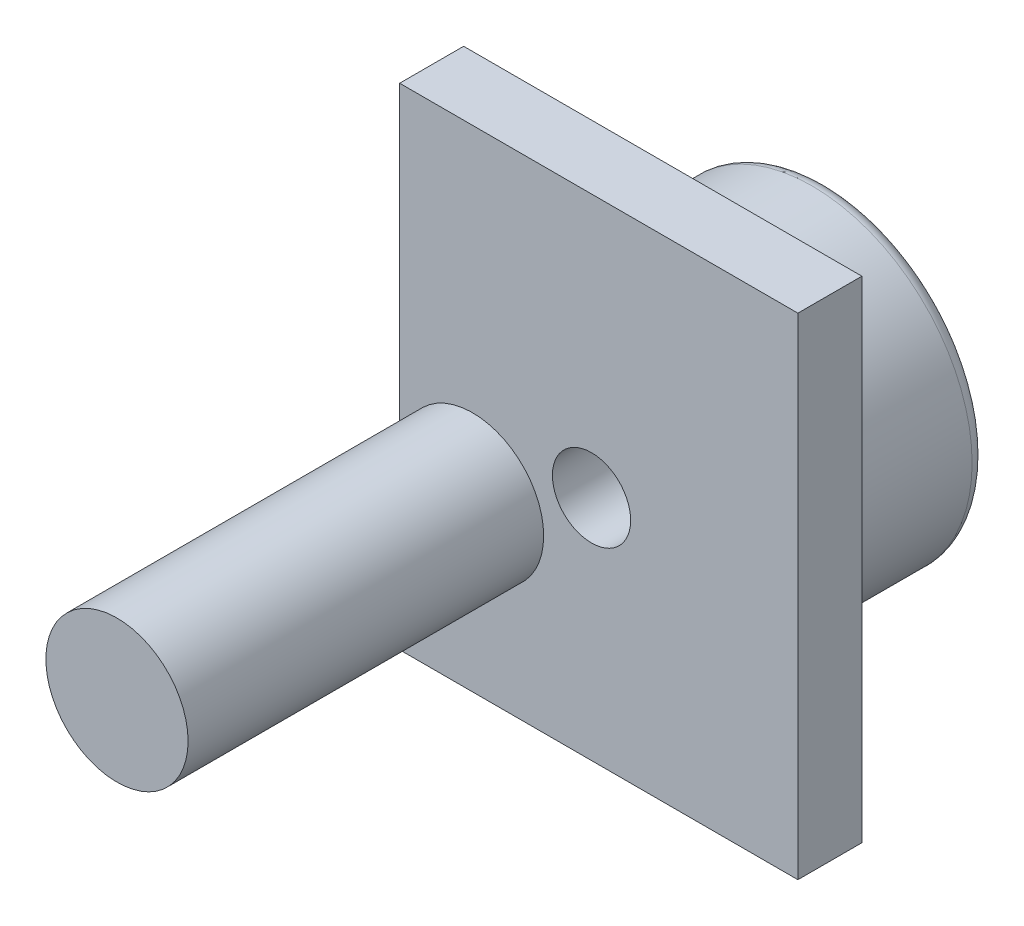
ISO-10303-21;
HEADER;
FILE_DESCRIPTION(('STEP AP214'),'2;1');
FILE_NAME('part.step','',(''),(''),'','','');
FILE_SCHEMA(('AUTOMOTIVE_DESIGN { 1 0 10303 214 1 1 1 1 }'));
ENDSEC;
DATA;
#1=APPLICATION_CONTEXT('core data for automotive mechanical design processes');
#2=APPLICATION_PROTOCOL_DEFINITION('international standard','automotive_design',2000,#1);
#3=PRODUCT_CONTEXT('',#1,'mechanical');
#4=PRODUCT('Part','Part','',(#3));
#5=PRODUCT_RELATED_PRODUCT_CATEGORY('part','',(#4));
#6=PRODUCT_DEFINITION_FORMATION('','',#4);
#7=PRODUCT_DEFINITION_CONTEXT('part definition',#1,'design');
#8=PRODUCT_DEFINITION('design','',#6,#7);
#9=PRODUCT_DEFINITION_SHAPE('','',#8);
#10=(LENGTH_UNIT() NAMED_UNIT(*) SI_UNIT(.MILLI.,.METRE.));
#11=(NAMED_UNIT(*) PLANE_ANGLE_UNIT() SI_UNIT($,.RADIAN.));
#12=(NAMED_UNIT(*) SI_UNIT($,.STERADIAN.) SOLID_ANGLE_UNIT());
#13=UNCERTAINTY_MEASURE_WITH_UNIT(LENGTH_MEASURE(1.E-05),#10,'distance_accuracy_value','');
#14=(GEOMETRIC_REPRESENTATION_CONTEXT(3) GLOBAL_UNCERTAINTY_ASSIGNED_CONTEXT((#13)) GLOBAL_UNIT_ASSIGNED_CONTEXT((#10,
#11,#12)) REPRESENTATION_CONTEXT('',''));
#15=CARTESIAN_POINT('',(0.,0.,0.));
#16=DIRECTION('',(0.,0.,1.));
#17=DIRECTION('',(1.,0.,0.));
#18=AXIS2_PLACEMENT_3D('',#15,#16,#17);
#19=CARTESIAN_POINT('',(0.,0.,4.8));
#20=DIRECTION('',(0.,0.,-1.));
#21=DIRECTION('',(-1.,0.,0.));
#22=AXIS2_PLACEMENT_3D('',#19,#20,#21);
#23=CYLINDRICAL_SURFACE('',#22,4.5);
#24=CARTESIAN_POINT('',(0.,0.,0.4));
#25=DIRECTION('',(0.,0.,1.));
#26=DIRECTION('',(1.,0.,0.));
#27=AXIS2_PLACEMENT_3D('',#24,#25,#26);
#28=CIRCLE('',#27,4.5);
#29=CARTESIAN_POINT('',(4.5,0.,0.4));
#30=VERTEX_POINT('',#29);
#31=EDGE_CURVE('E48',#30,#30,#28,.T.);
#32=ORIENTED_EDGE('',*,*,#31,.T.);
#33=EDGE_LOOP('',(#32));
#34=FACE_BOUND('',#33,.T.);
#35=CARTESIAN_POINT('',(0.,0.,4.8));
#36=DIRECTION('',(0.,0.,1.));
#37=DIRECTION('',(1.,0.,0.));
#38=AXIS2_PLACEMENT_3D('',#35,#36,#37);
#39=CIRCLE('',#38,4.5);
#40=CARTESIAN_POINT('',(4.5,0.,4.8));
#41=VERTEX_POINT('',#40);
#42=EDGE_CURVE('E169',#41,#41,#39,.T.);
#43=ORIENTED_EDGE('',*,*,#42,.F.);
#44=EDGE_LOOP('',(#43));
#45=FACE_BOUND('',#44,.T.);
#46=ADVANCED_FACE('F39',(#34,#45),#23,.T.);
#47=CARTESIAN_POINT('',(0.,0.,0.));
#48=DIRECTION('',(0.,0.,1.));
#49=DIRECTION('',(1.,0.,0.));
#50=AXIS2_PLACEMENT_3D('',#47,#48,#49);
#51=PLANE('',#50);
#52=DIRECTION('',(-1.,0.,0.));
#53=VECTOR('',#52,1.);
#54=CARTESIAN_POINT('',(3.,-1.73,0.));
#55=LINE('',#54,#53);
#56=CARTESIAN_POINT('',(3.,-1.73,0.));
#57=VERTEX_POINT('',#56);
#58=CARTESIAN_POINT('',(-3.,-1.73,0.));
#59=VERTEX_POINT('',#58);
#60=EDGE_CURVE('E129',#57,#59,#55,.T.);
#61=ORIENTED_EDGE('',*,*,#60,.F.);
#62=DIRECTION('',(0.5,-0.866025403784439,0.));
#63=VECTOR('',#62,1.);
#64=CARTESIAN_POINT('',(0.,3.46615242270663,0.));
#65=LINE('',#64,#63);
#66=CARTESIAN_POINT('',(0.,3.46615242270663,0.));
#67=VERTEX_POINT('',#66);
#68=EDGE_CURVE('E55',#67,#57,#65,.T.);
#69=ORIENTED_EDGE('',*,*,#68,.F.);
#70=DIRECTION('',(0.5,0.866025403784439,0.));
#71=VECTOR('',#70,1.);
#72=CARTESIAN_POINT('',(-3.,-1.73,0.));
#73=LINE('',#72,#71);
#74=EDGE_CURVE('E126',#59,#67,#73,.T.);
#75=ORIENTED_EDGE('',*,*,#74,.F.);
#76=EDGE_LOOP('',(#61,#69,#75));
#77=FACE_BOUND('',#76,.T.);
#78=CARTESIAN_POINT('',(0.,0.,0.));
#79=DIRECTION('',(0.,0.,1.));
#80=DIRECTION('',(1.,0.,0.));
#81=AXIS2_PLACEMENT_3D('',#78,#79,#80);
#82=CIRCLE('',#81,4.1);
#83=CARTESIAN_POINT('',(4.1,0.,0.));
#84=VERTEX_POINT('',#83);
#85=EDGE_CURVE('E11',#84,#84,#82,.F.);
#86=ORIENTED_EDGE('',*,*,#85,.T.);
#87=EDGE_LOOP('',(#86));
#88=FACE_BOUND('',#87,.T.);
#89=ADVANCED_FACE('F193',(#77,#88),#51,.F.);
#90=CARTESIAN_POINT('',(-5.4,7.4,6.6));
#91=DIRECTION('',(1.,0.,0.));
#92=DIRECTION('',(0.,1.,0.));
#93=AXIS2_PLACEMENT_3D('',#90,#91,#92);
#94=PLANE('',#93);
#95=DIRECTION('',(0.,-1.,0.));
#96=VECTOR('',#95,1.);
#97=CARTESIAN_POINT('',(-5.4,7.4,4.8));
#98=LINE('',#97,#96);
#99=CARTESIAN_POINT('',(-5.4,7.4,4.8));
#100=VERTEX_POINT('',#99);
#101=CARTESIAN_POINT('',(-5.4,-6.4,4.8));
#102=VERTEX_POINT('',#101);
#103=EDGE_CURVE('E144',#100,#102,#98,.T.);
#104=ORIENTED_EDGE('',*,*,#103,.T.);
#105=DIRECTION('',(0.,0.,-1.));
#106=VECTOR('',#105,1.);
#107=CARTESIAN_POINT('',(-5.4,-6.4,6.6));
#108=LINE('',#107,#106);
#109=CARTESIAN_POINT('',(-5.4,-6.4,6.6));
#110=VERTEX_POINT('',#109);
#111=EDGE_CURVE('E167',#110,#102,#108,.T.);
#112=ORIENTED_EDGE('',*,*,#111,.F.);
#113=DIRECTION('',(0.,-1.,0.));
#114=VECTOR('',#113,1.);
#115=CARTESIAN_POINT('',(-5.4,7.4,6.6));
#116=LINE('',#115,#114);
#117=CARTESIAN_POINT('',(-5.4,7.4,6.6));
#118=VERTEX_POINT('',#117);
#119=EDGE_CURVE('E147',#118,#110,#116,.T.);
#120=ORIENTED_EDGE('',*,*,#119,.F.);
#121=DIRECTION('',(0.,0.,-1.));
#122=VECTOR('',#121,1.);
#123=CARTESIAN_POINT('',(-5.4,7.4,6.6));
#124=LINE('',#123,#122);
#125=EDGE_CURVE('E153',#118,#100,#124,.T.);
#126=ORIENTED_EDGE('',*,*,#125,.T.);
#127=EDGE_LOOP('',(#104,#112,#120,#126));
#128=FACE_BOUND('',#127,.T.);
#129=ADVANCED_FACE('F197',(#128),#94,.F.);
#130=CARTESIAN_POINT('',(-5.4,-6.4,6.6));
#131=DIRECTION('',(0.,1.,0.));
#132=DIRECTION('',(0.,0.,1.));
#133=AXIS2_PLACEMENT_3D('',#130,#131,#132);
#134=PLANE('',#133);
#135=DIRECTION('',(1.,0.,0.));
#136=VECTOR('',#135,1.);
#137=CARTESIAN_POINT('',(-5.4,-6.4,4.8));
#138=LINE('',#137,#136);
#139=CARTESIAN_POINT('',(5.8,-6.4,4.8));
#140=VERTEX_POINT('',#139);
#141=EDGE_CURVE('E156',#102,#140,#138,.T.);
#142=ORIENTED_EDGE('',*,*,#141,.T.);
#143=DIRECTION('',(0.,0.,-1.));
#144=VECTOR('',#143,1.);
#145=CARTESIAN_POINT('',(5.8,-6.4,6.6));
#146=LINE('',#145,#144);
#147=CARTESIAN_POINT('',(5.8,-6.4,6.6));
#148=VERTEX_POINT('',#147);
#149=EDGE_CURVE('E164',#148,#140,#146,.T.);
#150=ORIENTED_EDGE('',*,*,#149,.F.);
#151=DIRECTION('',(1.,0.,0.));
#152=VECTOR('',#151,1.);
#153=CARTESIAN_POINT('',(-5.4,-6.4,6.6));
#154=LINE('',#153,#152);
#155=EDGE_CURVE('E93',#110,#148,#154,.T.);
#156=ORIENTED_EDGE('',*,*,#155,.F.);
#157=ORIENTED_EDGE('',*,*,#111,.T.);
#158=EDGE_LOOP('',(#142,#150,#156,#157));
#159=FACE_BOUND('',#158,.T.);
#160=ADVANCED_FACE('F203',(#159),#134,.F.);
#161=CARTESIAN_POINT('',(5.8,7.4,6.6));
#162=DIRECTION('',(-1.,0.,0.));
#163=DIRECTION('',(0.,-1.,0.));
#164=AXIS2_PLACEMENT_3D('',#161,#162,#163);
#165=PLANE('',#164);
#166=DIRECTION('',(0.,1.,0.));
#167=VECTOR('',#166,1.);
#168=CARTESIAN_POINT('',(5.8,7.4,4.8));
#169=LINE('',#168,#167);
#170=CARTESIAN_POINT('',(5.8,7.4,4.8));
#171=VERTEX_POINT('',#170);
#172=EDGE_CURVE('E158',#140,#171,#169,.T.);
#173=ORIENTED_EDGE('',*,*,#172,.T.);
#174=DIRECTION('',(0.,0.,-1.));
#175=VECTOR('',#174,1.);
#176=CARTESIAN_POINT('',(5.8,7.4,6.6));
#177=LINE('',#176,#175);
#178=CARTESIAN_POINT('',(5.8,7.4,6.6));
#179=VERTEX_POINT('',#178);
#180=EDGE_CURVE('E162',#179,#171,#177,.T.);
#181=ORIENTED_EDGE('',*,*,#180,.F.);
#182=DIRECTION('',(0.,1.,0.));
#183=VECTOR('',#182,1.);
#184=CARTESIAN_POINT('',(5.8,7.4,6.6));
#185=LINE('',#184,#183);
#186=EDGE_CURVE('E150',#148,#179,#185,.T.);
#187=ORIENTED_EDGE('',*,*,#186,.F.);
#188=ORIENTED_EDGE('',*,*,#149,.T.);
#189=EDGE_LOOP('',(#173,#181,#187,#188));
#190=FACE_BOUND('',#189,.T.);
#191=ADVANCED_FACE('F207',(#190),#165,.F.);
#192=CARTESIAN_POINT('',(-5.4,7.4,6.6));
#193=DIRECTION('',(0.,-1.,0.));
#194=DIRECTION('',(0.,0.,-1.));
#195=AXIS2_PLACEMENT_3D('',#192,#193,#194);
#196=PLANE('',#195);
#197=DIRECTION('',(-1.,0.,0.));
#198=VECTOR('',#197,1.);
#199=CARTESIAN_POINT('',(-5.4,7.4,4.8));
#200=LINE('',#199,#198);
#201=EDGE_CURVE('E85',#171,#100,#200,.T.);
#202=ORIENTED_EDGE('',*,*,#201,.T.);
#203=ORIENTED_EDGE('',*,*,#125,.F.);
#204=DIRECTION('',(-1.,0.,0.));
#205=VECTOR('',#204,1.);
#206=CARTESIAN_POINT('',(-5.4,7.4,6.6));
#207=LINE('',#206,#205);
#208=EDGE_CURVE('E64',#179,#118,#207,.T.);
#209=ORIENTED_EDGE('',*,*,#208,.F.);
#210=ORIENTED_EDGE('',*,*,#180,.T.);
#211=EDGE_LOOP('',(#202,#203,#209,#210));
#212=FACE_BOUND('',#211,.T.);
#213=ADVANCED_FACE('F210',(#212),#196,.F.);
#214=CARTESIAN_POINT('',(0.,0.,6.6));
#215=DIRECTION('',(0.,0.,1.));
#216=DIRECTION('',(1.,0.,0.));
#217=AXIS2_PLACEMENT_3D('',#214,#215,#216);
#218=PLANE('',#217);
#219=CARTESIAN_POINT('',(-0.00355210290584247,0.,6.6));
#220=DIRECTION('',(0.,0.,1.));
#221=DIRECTION('',(1.,0.,0.));
#222=AXIS2_PLACEMENT_3D('',#219,#220,#221);
#223=CIRCLE('',#222,1.1);
#224=CARTESIAN_POINT('',(1.09644789709416,0.,6.6));
#225=VERTEX_POINT('',#224);
#226=EDGE_CURVE('E43',#225,#225,#223,.T.);
#227=ORIENTED_EDGE('',*,*,#226,.F.);
#228=EDGE_LOOP('',(#227));
#229=FACE_BOUND('',#228,.T.);
#230=CARTESIAN_POINT('',(-3.35,-1.6,6.6));
#231=DIRECTION('',(0.,0.,1.));
#232=DIRECTION('',(1.,0.,0.));
#233=AXIS2_PLACEMENT_3D('',#230,#231,#232);
#234=CIRCLE('',#233,2.);
#235=CARTESIAN_POINT('',(-1.35,-1.6,6.6));
#236=VERTEX_POINT('',#235);
#237=EDGE_CURVE('E139',#236,#236,#234,.T.);
#238=ORIENTED_EDGE('',*,*,#237,.F.);
#239=EDGE_LOOP('',(#238));
#240=FACE_BOUND('',#239,.T.);
#241=ORIENTED_EDGE('',*,*,#119,.T.);
#242=ORIENTED_EDGE('',*,*,#155,.T.);
#243=ORIENTED_EDGE('',*,*,#186,.T.);
#244=ORIENTED_EDGE('',*,*,#208,.T.);
#245=EDGE_LOOP('',(#241,#242,#243,#244));
#246=FACE_BOUND('',#245,.T.);
#247=ADVANCED_FACE('F188',(#229,#240,#246),#218,.T.);
#248=CARTESIAN_POINT('',(0.,0.,4.8));
#249=DIRECTION('',(0.,0.,1.));
#250=DIRECTION('',(1.,0.,0.));
#251=AXIS2_PLACEMENT_3D('',#248,#249,#250);
#252=PLANE('',#251);
#253=ORIENTED_EDGE('',*,*,#42,.T.);
#254=EDGE_LOOP('',(#253));
#255=FACE_BOUND('',#254,.T.);
#256=ORIENTED_EDGE('',*,*,#103,.F.);
#257=ORIENTED_EDGE('',*,*,#201,.F.);
#258=ORIENTED_EDGE('',*,*,#172,.F.);
#259=ORIENTED_EDGE('',*,*,#141,.F.);
#260=EDGE_LOOP('',(#256,#257,#258,#259));
#261=FACE_BOUND('',#260,.T.);
#262=ADVANCED_FACE('F179',(#255,#261),#252,.F.);
#263=CARTESIAN_POINT('',(0.,0.,0.4));
#264=DIRECTION('',(0.,0.,1.));
#265=DIRECTION('',(1.,0.,0.));
#266=AXIS2_PLACEMENT_3D('',#263,#264,#265);
#267=TOROIDAL_SURFACE('',#266,4.1,0.4);
#268=ORIENTED_EDGE('',*,*,#85,.F.);
#269=EDGE_LOOP('',(#268));
#270=FACE_BOUND('',#269,.T.);
#271=ORIENTED_EDGE('',*,*,#31,.F.);
#272=EDGE_LOOP('',(#271));
#273=FACE_BOUND('',#272,.T.);
#274=ADVANCED_FACE('F41',(#270,#273),#267,.T.);
#275=CARTESIAN_POINT('',(-3.35,-1.6,16.6));
#276=DIRECTION('',(0.,0.,-1.));
#277=DIRECTION('',(-1.,0.,0.));
#278=AXIS2_PLACEMENT_3D('',#275,#276,#277);
#279=CYLINDRICAL_SURFACE('',#278,2.);
#280=CARTESIAN_POINT('',(-3.35,-1.6,16.6));
#281=DIRECTION('',(0.,0.,1.));
#282=DIRECTION('',(1.,0.,0.));
#283=AXIS2_PLACEMENT_3D('',#280,#281,#282);
#284=CIRCLE('',#283,2.);
#285=CARTESIAN_POINT('',(-1.35,-1.6,16.6));
#286=VERTEX_POINT('',#285);
#287=EDGE_CURVE('E141',#286,#286,#284,.T.);
#288=ORIENTED_EDGE('',*,*,#287,.F.);
#289=EDGE_LOOP('',(#288));
#290=FACE_BOUND('',#289,.T.);
#291=ORIENTED_EDGE('',*,*,#237,.T.);
#292=EDGE_LOOP('',(#291));
#293=FACE_BOUND('',#292,.T.);
#294=ADVANCED_FACE('F178',(#290,#293),#279,.T.);
#295=CARTESIAN_POINT('',(-3.35,-1.6,16.6));
#296=DIRECTION('',(0.,0.,1.));
#297=DIRECTION('',(1.,0.,0.));
#298=AXIS2_PLACEMENT_3D('',#295,#296,#297);
#299=PLANE('',#298);
#300=ORIENTED_EDGE('',*,*,#287,.T.);
#301=EDGE_LOOP('',(#300));
#302=FACE_BOUND('',#301,.T.);
#303=ADVANCED_FACE('F185',(#302),#299,.T.);
#304=CARTESIAN_POINT('',(0.,3.46615242270663,4.));
#305=DIRECTION('',(0.866025403784439,0.5,0.));
#306=DIRECTION('',(-0.5,0.866025403784439,0.));
#307=AXIS2_PLACEMENT_3D('',#304,#305,#306);
#308=PLANE('',#307);
#309=ORIENTED_EDGE('',*,*,#68,.T.);
#310=DIRECTION('',(0.,0.,-1.));
#311=VECTOR('',#310,1.);
#312=CARTESIAN_POINT('',(3.,-1.73,4.));
#313=LINE('',#312,#311);
#314=CARTESIAN_POINT('',(3.,-1.73,4.));
#315=VERTEX_POINT('',#314);
#316=EDGE_CURVE('E107',#315,#57,#313,.T.);
#317=ORIENTED_EDGE('',*,*,#316,.F.);
#318=DIRECTION('',(0.5,-0.866025403784439,0.));
#319=VECTOR('',#318,1.);
#320=CARTESIAN_POINT('',(0.,3.46615242270663,4.));
#321=LINE('',#320,#319);
#322=CARTESIAN_POINT('',(0.,3.46615242270663,4.));
#323=VERTEX_POINT('',#322);
#324=EDGE_CURVE('E111',#323,#315,#321,.T.);
#325=ORIENTED_EDGE('',*,*,#324,.F.);
#326=DIRECTION('',(0.,0.,-1.));
#327=VECTOR('',#326,1.);
#328=CARTESIAN_POINT('',(0.,3.46615242270663,4.));
#329=LINE('',#328,#327);
#330=EDGE_CURVE('E137',#323,#67,#329,.T.);
#331=ORIENTED_EDGE('',*,*,#330,.T.);
#332=EDGE_LOOP('',(#309,#317,#325,#331));
#333=FACE_BOUND('',#332,.T.);
#334=ADVANCED_FACE('F109',(#333),#308,.F.);
#335=CARTESIAN_POINT('',(-3.,-1.73,4.));
#336=DIRECTION('',(-0.866025403784439,0.5,0.));
#337=DIRECTION('',(-0.5,-0.866025403784439,0.));
#338=AXIS2_PLACEMENT_3D('',#335,#336,#337);
#339=PLANE('',#338);
#340=ORIENTED_EDGE('',*,*,#74,.T.);
#341=ORIENTED_EDGE('',*,*,#330,.F.);
#342=DIRECTION('',(0.5,0.866025403784439,0.));
#343=VECTOR('',#342,1.);
#344=CARTESIAN_POINT('',(-3.,-1.73,4.));
#345=LINE('',#344,#343);
#346=CARTESIAN_POINT('',(-3.,-1.73,4.));
#347=VERTEX_POINT('',#346);
#348=EDGE_CURVE('E117',#347,#323,#345,.T.);
#349=ORIENTED_EDGE('',*,*,#348,.F.);
#350=DIRECTION('',(0.,0.,-1.));
#351=VECTOR('',#350,1.);
#352=CARTESIAN_POINT('',(-3.,-1.73,4.));
#353=LINE('',#352,#351);
#354=EDGE_CURVE('E116',#347,#59,#353,.T.);
#355=ORIENTED_EDGE('',*,*,#354,.T.);
#356=EDGE_LOOP('',(#340,#341,#349,#355));
#357=FACE_BOUND('',#356,.T.);
#358=ADVANCED_FACE('F222',(#357),#339,.F.);
#359=CARTESIAN_POINT('',(3.,-1.73,4.));
#360=DIRECTION('',(0.,-1.,0.));
#361=DIRECTION('',(0.,0.,-1.));
#362=AXIS2_PLACEMENT_3D('',#359,#360,#361);
#363=PLANE('',#362);
#364=ORIENTED_EDGE('',*,*,#60,.T.);
#365=ORIENTED_EDGE('',*,*,#354,.F.);
#366=DIRECTION('',(-1.,0.,0.));
#367=VECTOR('',#366,1.);
#368=CARTESIAN_POINT('',(3.,-1.73,4.));
#369=LINE('',#368,#367);
#370=EDGE_CURVE('E120',#315,#347,#369,.T.);
#371=ORIENTED_EDGE('',*,*,#370,.F.);
#372=ORIENTED_EDGE('',*,*,#316,.T.);
#373=EDGE_LOOP('',(#364,#365,#371,#372));
#374=FACE_BOUND('',#373,.T.);
#375=ADVANCED_FACE('F121',(#374),#363,.F.);
#376=CARTESIAN_POINT('',(0.,0.,4.));
#377=DIRECTION('',(0.,0.,-1.));
#378=DIRECTION('',(-1.,0.,0.));
#379=AXIS2_PLACEMENT_3D('',#376,#377,#378);
#380=PLANE('',#379);
#381=CARTESIAN_POINT('',(-0.00355210290584247,0.,4.));
#382=DIRECTION('',(0.,0.,-1.));
#383=DIRECTION('',(-1.,0.,0.));
#384=AXIS2_PLACEMENT_3D('',#381,#382,#383);
#385=CIRCLE('',#384,1.1);
#386=CARTESIAN_POINT('',(-1.10355210290584,0.,4.));
#387=VERTEX_POINT('',#386);
#388=EDGE_CURVE('E132',#387,#387,#385,.T.);
#389=ORIENTED_EDGE('',*,*,#388,.F.);
#390=EDGE_LOOP('',(#389));
#391=FACE_BOUND('',#390,.T.);
#392=ORIENTED_EDGE('',*,*,#324,.T.);
#393=ORIENTED_EDGE('',*,*,#370,.T.);
#394=ORIENTED_EDGE('',*,*,#348,.T.);
#395=EDGE_LOOP('',(#392,#393,#394));
#396=FACE_BOUND('',#395,.T.);
#397=ADVANCED_FACE('F125',(#391,#396),#380,.T.);
#398=CARTESIAN_POINT('',(-0.00355210290584247,0.,16.6));
#399=DIRECTION('',(0.,0.,-1.));
#400=DIRECTION('',(-1.,0.,0.));
#401=AXIS2_PLACEMENT_3D('',#398,#399,#400);
#402=CYLINDRICAL_SURFACE('',#401,1.1);
#403=ORIENTED_EDGE('',*,*,#226,.T.);
#404=EDGE_LOOP('',(#403));
#405=FACE_BOUND('',#404,.T.);
#406=ORIENTED_EDGE('',*,*,#388,.T.);
#407=EDGE_LOOP('',(#406));
#408=FACE_BOUND('',#407,.T.);
#409=ADVANCED_FACE('F230',(#405,#408),#402,.F.);
#410=CLOSED_SHELL('',(#46,#89,#129,#160,#191,#213,#247,#262,#274,#294,#303,#334,#358,#375,#397,#409));
#411=MANIFOLD_SOLID_BREP('B2',#410);
#412=ADVANCED_BREP_SHAPE_REPRESENTATION('',(#18,#411),#14);
#413=SHAPE_DEFINITION_REPRESENTATION(#9,#412);
ENDSEC;
END-ISO-10303-21;
